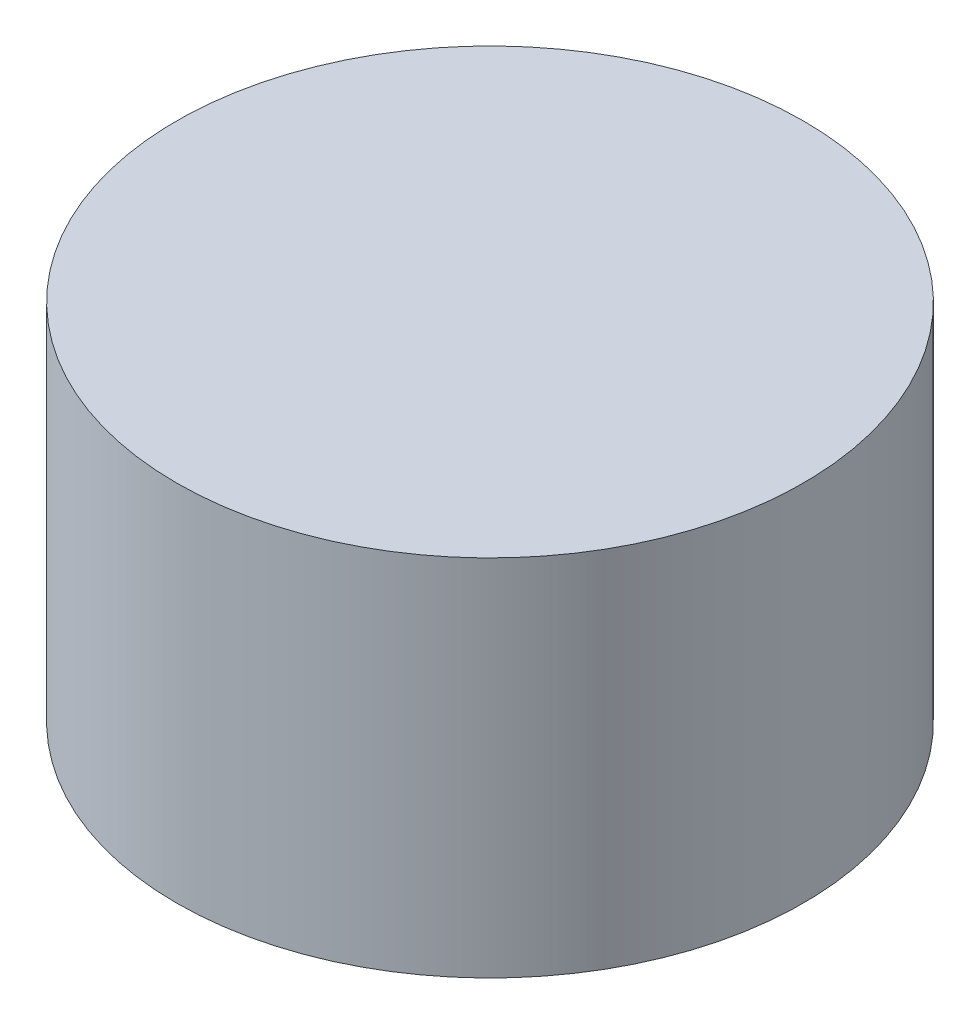
ISO-10303-21;
HEADER;
FILE_DESCRIPTION(('STEP AP214'),'2;1');
FILE_NAME('part.step','',(''),(''),'','','');
FILE_SCHEMA(('AUTOMOTIVE_DESIGN { 1 0 10303 214 1 1 1 1 }'));
ENDSEC;
DATA;
#1=APPLICATION_CONTEXT('core data for automotive mechanical design processes');
#2=APPLICATION_PROTOCOL_DEFINITION('international standard','automotive_design',2000,#1);
#3=PRODUCT_CONTEXT('',#1,'mechanical');
#4=PRODUCT('Part','Part','',(#3));
#5=PRODUCT_RELATED_PRODUCT_CATEGORY('part','',(#4));
#6=PRODUCT_DEFINITION_FORMATION('','',#4);
#7=PRODUCT_DEFINITION_CONTEXT('part definition',#1,'design');
#8=PRODUCT_DEFINITION('design','',#6,#7);
#9=PRODUCT_DEFINITION_SHAPE('','',#8);
#10=(LENGTH_UNIT() NAMED_UNIT(*) SI_UNIT(.MILLI.,.METRE.));
#11=(NAMED_UNIT(*) PLANE_ANGLE_UNIT() SI_UNIT($,.RADIAN.));
#12=(NAMED_UNIT(*) SI_UNIT($,.STERADIAN.) SOLID_ANGLE_UNIT());
#13=UNCERTAINTY_MEASURE_WITH_UNIT(LENGTH_MEASURE(1.E-05),#10,'distance_accuracy_value','');
#14=(GEOMETRIC_REPRESENTATION_CONTEXT(3) GLOBAL_UNCERTAINTY_ASSIGNED_CONTEXT((#13)) GLOBAL_UNIT_ASSIGNED_CONTEXT((#10,
#11,#12)) REPRESENTATION_CONTEXT('',''));
#15=CARTESIAN_POINT('',(0.,0.,0.));
#16=DIRECTION('',(0.,0.,1.));
#17=DIRECTION('',(1.,0.,0.));
#18=AXIS2_PLACEMENT_3D('',#15,#16,#17);
#19=CARTESIAN_POINT('',(-5.75486230347999,5.,-5.64162840012385));
#20=DIRECTION('',(0.,-1.,0.));
#21=DIRECTION('',(0.,0.,-1.));
#22=AXIS2_PLACEMENT_3D('',#19,#20,#21);
#23=CYLINDRICAL_SURFACE('',#22,4.308872245);
#24=CARTESIAN_POINT('',(-5.75486230347999,5.,-5.64162840012385));
#25=DIRECTION('',(0.,1.,0.));
#26=DIRECTION('',(0.,0.,1.));
#27=AXIS2_PLACEMENT_3D('',#24,#25,#26);
#28=CIRCLE('',#27,4.308872245);
#29=CARTESIAN_POINT('',(-5.75486230347999,5.,-1.33275615512385));
#30=VERTEX_POINT('',#29);
#31=EDGE_CURVE('E10',#30,#30,#28,.T.);
#32=ORIENTED_EDGE('',*,*,#31,.F.);
#33=EDGE_LOOP('',(#32));
#34=FACE_BOUND('',#33,.T.);
#35=CARTESIAN_POINT('',(-5.75486230347999,0.,-5.64162840012385));
#36=DIRECTION('',(0.,1.,0.));
#37=DIRECTION('',(0.,0.,1.));
#38=AXIS2_PLACEMENT_3D('',#35,#36,#37);
#39=CIRCLE('',#38,4.308872245);
#40=CARTESIAN_POINT('',(-5.75486230347999,0.,-1.33275615512385));
#41=VERTEX_POINT('',#40);
#42=EDGE_CURVE('E33',#41,#41,#39,.T.);
#43=ORIENTED_EDGE('',*,*,#42,.T.);
#44=EDGE_LOOP('',(#43));
#45=FACE_BOUND('',#44,.T.);
#46=ADVANCED_FACE('F30',(#34,#45),#23,.T.);
#47=CARTESIAN_POINT('',(-5.75486230347999,5.,-5.64162840012385));
#48=DIRECTION('',(0.,1.,0.));
#49=DIRECTION('',(0.,0.,1.));
#50=AXIS2_PLACEMENT_3D('',#47,#48,#49);
#51=PLANE('',#50);
#52=ORIENTED_EDGE('',*,*,#31,.T.);
#53=EDGE_LOOP('',(#52));
#54=FACE_BOUND('',#53,.T.);
#55=ADVANCED_FACE('F45',(#54),#51,.T.);
#56=CARTESIAN_POINT('',(-5.75486230347999,0.,-5.64162840012385));
#57=DIRECTION('',(0.,1.,0.));
#58=DIRECTION('',(0.,0.,1.));
#59=AXIS2_PLACEMENT_3D('',#56,#57,#58);
#60=PLANE('',#59);
#61=ORIENTED_EDGE('',*,*,#42,.F.);
#62=EDGE_LOOP('',(#61));
#63=FACE_BOUND('',#62,.T.);
#64=ADVANCED_FACE('F43',(#63),#60,.F.);
#65=CLOSED_SHELL('',(#46,#55,#64));
#66=MANIFOLD_SOLID_BREP('B2',#65);
#67=ADVANCED_BREP_SHAPE_REPRESENTATION('',(#18,#66),#14);
#68=SHAPE_DEFINITION_REPRESENTATION(#9,#67);
ENDSEC;
END-ISO-10303-21;
